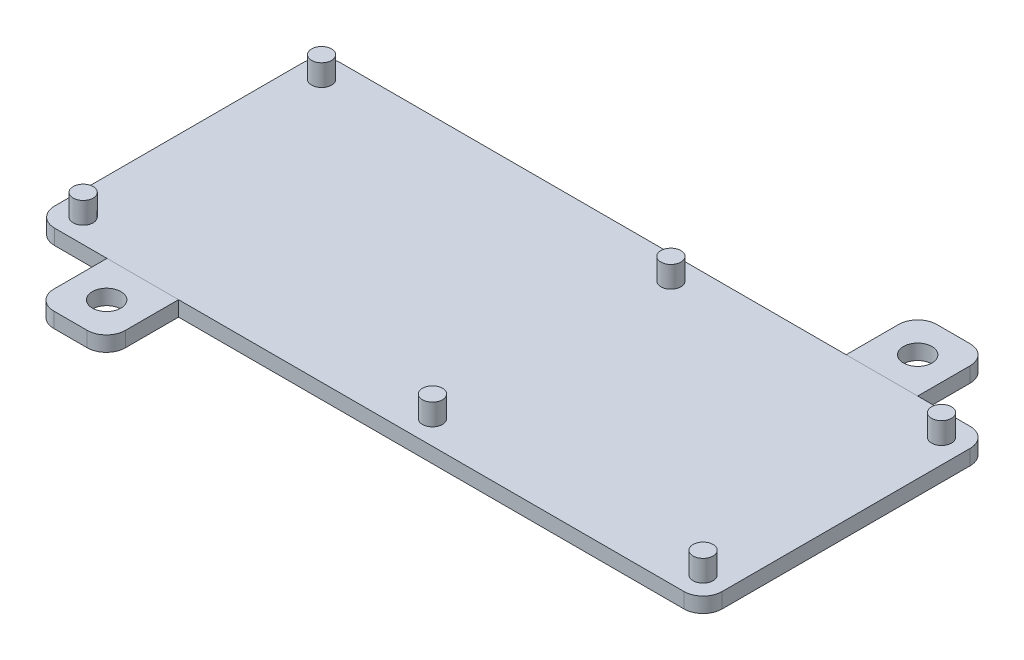
ISO-10303-21;
HEADER;
FILE_DESCRIPTION(('STEP AP214'),'2;1');
FILE_NAME('part.step','',(''),(''),'','','');
FILE_SCHEMA(('AUTOMOTIVE_DESIGN { 1 0 10303 214 1 1 1 1 }'));
ENDSEC;
DATA;
#1=APPLICATION_CONTEXT('core data for automotive mechanical design processes');
#2=APPLICATION_PROTOCOL_DEFINITION('international standard','automotive_design',2000,#1);
#3=PRODUCT_CONTEXT('',#1,'mechanical');
#4=PRODUCT('Part','Part','',(#3));
#5=PRODUCT_RELATED_PRODUCT_CATEGORY('part','',(#4));
#6=PRODUCT_DEFINITION_FORMATION('','',#4);
#7=PRODUCT_DEFINITION_CONTEXT('part definition',#1,'design');
#8=PRODUCT_DEFINITION('design','',#6,#7);
#9=PRODUCT_DEFINITION_SHAPE('','',#8);
#10=(LENGTH_UNIT() NAMED_UNIT(*) SI_UNIT(.MILLI.,.METRE.));
#11=(NAMED_UNIT(*) PLANE_ANGLE_UNIT() SI_UNIT($,.RADIAN.));
#12=(NAMED_UNIT(*) SI_UNIT($,.STERADIAN.) SOLID_ANGLE_UNIT());
#13=UNCERTAINTY_MEASURE_WITH_UNIT(LENGTH_MEASURE(1.E-05),#10,'distance_accuracy_value','');
#14=(GEOMETRIC_REPRESENTATION_CONTEXT(3) GLOBAL_UNCERTAINTY_ASSIGNED_CONTEXT((#13)) GLOBAL_UNIT_ASSIGNED_CONTEXT((#10,
#11,#12)) REPRESENTATION_CONTEXT('',''));
#15=CARTESIAN_POINT('',(0.,0.,0.));
#16=DIRECTION('',(0.,0.,1.));
#17=DIRECTION('',(1.,0.,0.));
#18=AXIS2_PLACEMENT_3D('',#15,#16,#17);
#19=CARTESIAN_POINT('',(-61.8399053845255,-42.5633245438735,-10.7268843414368));
#20=DIRECTION('',(1.,0.,0.));
#21=DIRECTION('',(0.,0.,-1.));
#22=AXIS2_PLACEMENT_3D('',#19,#20,#21);
#23=PLANE('',#22);
#24=DIRECTION('',(0.,0.,1.));
#25=VECTOR('',#24,1.);
#26=CARTESIAN_POINT('',(-61.8399053845255,-45.7383245438735,-10.7268843414368));
#27=LINE('',#26,#25);
#28=CARTESIAN_POINT('',(-61.8399053845255,-45.7383245438735,-21.7268843414368));
#29=VERTEX_POINT('',#28);
#30=CARTESIAN_POINT('',(-61.8399053845255,-45.7383245438735,-10.7268843414368));
#31=VERTEX_POINT('',#30);
#32=EDGE_CURVE('E128',#29,#31,#27,.T.);
#33=ORIENTED_EDGE('',*,*,#32,.F.);
#34=DIRECTION('',(0.,-1.,0.));
#35=VECTOR('',#34,1.);
#36=CARTESIAN_POINT('',(-61.8399053845255,-42.5633245438735,-21.7268843414368));
#37=LINE('',#36,#35);
#38=CARTESIAN_POINT('',(-61.8399053845255,-42.5633245438735,-21.7268843414368));
#39=VERTEX_POINT('',#38);
#40=EDGE_CURVE('E12',#29,#39,#37,.F.);
#41=ORIENTED_EDGE('',*,*,#40,.T.);
#42=DIRECTION('',(0.,0.,1.));
#43=VECTOR('',#42,1.);
#44=CARTESIAN_POINT('',(-61.8399053845255,-42.5633245438735,-10.7268843414368));
#45=LINE('',#44,#43);
#46=CARTESIAN_POINT('',(-61.8399053845255,-42.5633245438735,-10.7268843414368));
#47=VERTEX_POINT('',#46);
#48=EDGE_CURVE('E140',#39,#47,#45,.T.);
#49=ORIENTED_EDGE('',*,*,#48,.T.);
#50=DIRECTION('',(0.,-1.,0.));
#51=VECTOR('',#50,1.);
#52=CARTESIAN_POINT('',(-61.8399053845255,-42.5633245438735,-10.7268843414368));
#53=LINE('',#52,#51);
#54=EDGE_CURVE('E116',#47,#31,#53,.T.);
#55=ORIENTED_EDGE('',*,*,#54,.T.);
#56=EDGE_LOOP('',(#33,#41,#49,#55));
#57=FACE_BOUND('',#56,.T.);
#58=ADVANCED_FACE('F52',(#57),#23,.T.);
#59=CARTESIAN_POINT('',(-61.8399053845255,-42.5633245438735,-25.7268843414368));
#60=DIRECTION('',(0.,0.,-1.));
#61=DIRECTION('',(-1.,0.,0.));
#62=AXIS2_PLACEMENT_3D('',#59,#60,#61);
#63=PLANE('',#62);
#64=DIRECTION('',(1.,0.,0.));
#65=VECTOR('',#64,1.);
#66=CARTESIAN_POINT('',(-61.8399053845255,-45.7383245438735,-25.7268843414368));
#67=LINE('',#66,#65);
#68=CARTESIAN_POINT('',(-72.8399053845255,-45.7383245438735,-25.7268843414368));
#69=VERTEX_POINT('',#68);
#70=CARTESIAN_POINT('',(-65.8399053845255,-45.7383245438735,-25.7268843414368));
#71=VERTEX_POINT('',#70);
#72=EDGE_CURVE('E125',#69,#71,#67,.T.);
#73=ORIENTED_EDGE('',*,*,#72,.F.);
#74=DIRECTION('',(0.,-1.,0.));
#75=VECTOR('',#74,1.);
#76=CARTESIAN_POINT('',(-72.8399053845255,-42.5633245438735,-25.7268843414368));
#77=LINE('',#76,#75);
#78=CARTESIAN_POINT('',(-72.8399053845255,-42.5633245438735,-25.7268843414368));
#79=VERTEX_POINT('',#78);
#80=EDGE_CURVE('E155',#69,#79,#77,.F.);
#81=ORIENTED_EDGE('',*,*,#80,.T.);
#82=DIRECTION('',(1.,0.,0.));
#83=VECTOR('',#82,1.);
#84=CARTESIAN_POINT('',(-61.8399053845255,-42.5633245438735,-25.7268843414368));
#85=LINE('',#84,#83);
#86=CARTESIAN_POINT('',(-65.8399053845255,-42.5633245438735,-25.7268843414368));
#87=VERTEX_POINT('',#86);
#88=EDGE_CURVE('E135',#79,#87,#85,.T.);
#89=ORIENTED_EDGE('',*,*,#88,.T.);
#90=DIRECTION('',(0.,-1.,0.));
#91=VECTOR('',#90,1.);
#92=CARTESIAN_POINT('',(-65.8399053845255,-42.5633245438735,-25.7268843414368));
#93=LINE('',#92,#91);
#94=EDGE_CURVE('E152',#87,#71,#93,.T.);
#95=ORIENTED_EDGE('',*,*,#94,.T.);
#96=EDGE_LOOP('',(#73,#81,#89,#95));
#97=FACE_BOUND('',#96,.T.);
#98=ADVANCED_FACE('F165',(#97),#63,.T.);
#99=CARTESIAN_POINT('',(-76.8399053845255,-42.5633245438735,-10.7268843414368));
#100=DIRECTION('',(-1.,0.,0.));
#101=DIRECTION('',(0.,0.,1.));
#102=AXIS2_PLACEMENT_3D('',#99,#100,#101);
#103=PLANE('',#102);
#104=DIRECTION('',(0.,0.,-1.));
#105=VECTOR('',#104,1.);
#106=CARTESIAN_POINT('',(-76.8399053845255,-42.5633245438735,-10.7268843414368));
#107=LINE('',#106,#105);
#108=CARTESIAN_POINT('',(-76.8399053845255,-42.5633245438735,-10.7268843414368));
#109=VERTEX_POINT('',#108);
#110=CARTESIAN_POINT('',(-76.8399053845255,-42.5633245438735,-21.7268843414368));
#111=VERTEX_POINT('',#110);
#112=EDGE_CURVE('E137',#109,#111,#107,.T.);
#113=ORIENTED_EDGE('',*,*,#112,.T.);
#114=DIRECTION('',(0.,-1.,0.));
#115=VECTOR('',#114,1.);
#116=CARTESIAN_POINT('',(-76.8399053845255,-42.5633245438735,-21.7268843414368));
#117=LINE('',#116,#115);
#118=CARTESIAN_POINT('',(-76.8399053845255,-45.7383245438735,-21.7268843414368));
#119=VERTEX_POINT('',#118);
#120=EDGE_CURVE('E123',#111,#119,#117,.T.);
#121=ORIENTED_EDGE('',*,*,#120,.T.);
#122=DIRECTION('',(0.,0.,-1.));
#123=VECTOR('',#122,1.);
#124=CARTESIAN_POINT('',(-76.8399053845255,-45.7383245438735,-10.7268843414368));
#125=LINE('',#124,#123);
#126=CARTESIAN_POINT('',(-76.8399053845255,-45.7383245438735,-10.7268843414368));
#127=VERTEX_POINT('',#126);
#128=EDGE_CURVE('E120',#127,#119,#125,.T.);
#129=ORIENTED_EDGE('',*,*,#128,.F.);
#130=DIRECTION('',(0.,-1.,0.));
#131=VECTOR('',#130,1.);
#132=CARTESIAN_POINT('',(-76.8399053845255,-42.5633245438735,-10.7268843414368));
#133=LINE('',#132,#131);
#134=EDGE_CURVE('E105',#109,#127,#133,.T.);
#135=ORIENTED_EDGE('',*,*,#134,.F.);
#136=EDGE_LOOP('',(#113,#121,#129,#135));
#137=FACE_BOUND('',#136,.T.);
#138=ADVANCED_FACE('F121',(#137),#103,.T.);
#139=CARTESIAN_POINT('',(-61.8399053845255,-42.5633245438735,-10.7268843414368));
#140=DIRECTION('',(0.,0.,1.));
#141=DIRECTION('',(1.,0.,0.));
#142=AXIS2_PLACEMENT_3D('',#139,#140,#141);
#143=PLANE('',#142);
#144=DIRECTION('',(-1.,0.,0.));
#145=VECTOR('',#144,1.);
#146=CARTESIAN_POINT('',(-61.8399053845255,-45.7383245438735,-10.7268843414368));
#147=LINE('',#146,#145);
#148=EDGE_CURVE('E110',#31,#127,#147,.T.);
#149=ORIENTED_EDGE('',*,*,#148,.F.);
#150=ORIENTED_EDGE('',*,*,#54,.F.);
#151=DIRECTION('',(-1.,0.,0.));
#152=VECTOR('',#151,1.);
#153=CARTESIAN_POINT('',(-61.8399053845255,-42.5633245438735,-10.7268843414368));
#154=LINE('',#153,#152);
#155=EDGE_CURVE('E112',#47,#109,#154,.T.);
#156=ORIENTED_EDGE('',*,*,#155,.T.);
#157=ORIENTED_EDGE('',*,*,#134,.T.);
#158=EDGE_LOOP('',(#149,#150,#156,#157));
#159=FACE_BOUND('',#158,.T.);
#160=ADVANCED_FACE('F107',(#159),#143,.T.);
#161=CARTESIAN_POINT('',(0.,-42.5633245438735,0.));
#162=DIRECTION('',(0.,1.,0.));
#163=DIRECTION('',(0.,0.,1.));
#164=AXIS2_PLACEMENT_3D('',#161,#162,#163);
#165=PLANE('',#164);
#166=CARTESIAN_POINT('',(-69.3399053845255,-42.5633245438735,-18.2268843414368));
#167=DIRECTION('',(0.,-1.,0.));
#168=DIRECTION('',(0.,0.,-1.));
#169=AXIS2_PLACEMENT_3D('',#166,#167,#168);
#170=CIRCLE('',#169,3.00000000000001);
#171=CARTESIAN_POINT('',(-69.3399053845255,-42.5633245438735,-21.2268843414368));
#172=VERTEX_POINT('',#171);
#173=EDGE_CURVE('E131',#172,#172,#170,.T.);
#174=ORIENTED_EDGE('',*,*,#173,.T.);
#175=EDGE_LOOP('',(#174));
#176=FACE_BOUND('',#175,.T.);
#177=ORIENTED_EDGE('',*,*,#88,.F.);
#178=CARTESIAN_POINT('',(-72.8399053845255,-42.5633245438735,-21.7268843414368));
#179=DIRECTION('',(0.,1.,0.));
#180=DIRECTION('',(0.,0.,1.));
#181=AXIS2_PLACEMENT_3D('',#178,#179,#180);
#182=CIRCLE('',#181,4.);
#183=EDGE_CURVE('E60',#79,#111,#182,.T.);
#184=ORIENTED_EDGE('',*,*,#183,.T.);
#185=ORIENTED_EDGE('',*,*,#112,.F.);
#186=ORIENTED_EDGE('',*,*,#155,.F.);
#187=ORIENTED_EDGE('',*,*,#48,.F.);
#188=CARTESIAN_POINT('',(-65.8399053845255,-42.5633245438735,-21.7268843414368));
#189=DIRECTION('',(0.,1.,0.));
#190=DIRECTION('',(0.,0.,1.));
#191=AXIS2_PLACEMENT_3D('',#188,#189,#190);
#192=CIRCLE('',#191,4.);
#193=EDGE_CURVE('E72',#39,#87,#192,.T.);
#194=ORIENTED_EDGE('',*,*,#193,.T.);
#195=EDGE_LOOP('',(#177,#184,#185,#186,#187,#194));
#196=FACE_BOUND('',#195,.T.);
#197=ADVANCED_FACE('F158',(#176,#196),#165,.T.);
#198=CARTESIAN_POINT('',(0.,-45.7383245438735,0.));
#199=DIRECTION('',(0.,1.,0.));
#200=DIRECTION('',(0.,0.,1.));
#201=AXIS2_PLACEMENT_3D('',#198,#199,#200);
#202=PLANE('',#201);
#203=CARTESIAN_POINT('',(-69.3399053845255,-45.7383245438735,-18.2268843414368));
#204=DIRECTION('',(0.,-1.,0.));
#205=DIRECTION('',(0.,0.,-1.));
#206=AXIS2_PLACEMENT_3D('',#203,#204,#205);
#207=CIRCLE('',#206,3.00000000000001);
#208=CARTESIAN_POINT('',(-69.3399053845255,-45.7383245438735,-21.2268843414368));
#209=VERTEX_POINT('',#208);
#210=EDGE_CURVE('E142',#209,#209,#207,.T.);
#211=ORIENTED_EDGE('',*,*,#210,.F.);
#212=EDGE_LOOP('',(#211));
#213=FACE_BOUND('',#212,.T.);
#214=ORIENTED_EDGE('',*,*,#128,.T.);
#215=CARTESIAN_POINT('',(-72.8399053845255,-45.7383245438735,-21.7268843414368));
#216=DIRECTION('',(0.,1.,0.));
#217=DIRECTION('',(0.,0.,1.));
#218=AXIS2_PLACEMENT_3D('',#215,#216,#217);
#219=CIRCLE('',#218,4.);
#220=EDGE_CURVE('E150',#119,#69,#219,.F.);
#221=ORIENTED_EDGE('',*,*,#220,.T.);
#222=ORIENTED_EDGE('',*,*,#72,.T.);
#223=CARTESIAN_POINT('',(-65.8399053845255,-45.7383245438735,-21.7268843414368));
#224=DIRECTION('',(0.,1.,0.));
#225=DIRECTION('',(0.,0.,1.));
#226=AXIS2_PLACEMENT_3D('',#223,#224,#225);
#227=CIRCLE('',#226,4.);
#228=EDGE_CURVE('E148',#71,#29,#227,.F.);
#229=ORIENTED_EDGE('',*,*,#228,.T.);
#230=ORIENTED_EDGE('',*,*,#32,.T.);
#231=ORIENTED_EDGE('',*,*,#148,.T.);
#232=EDGE_LOOP('',(#214,#221,#222,#229,#230,#231));
#233=FACE_BOUND('',#232,.T.);
#234=ADVANCED_FACE('F127',(#213,#233),#202,.F.);
#235=CARTESIAN_POINT('',(-69.3399053845255,-42.5633245438735,-18.2268843414368));
#236=DIRECTION('',(0.,-1.,0.));
#237=DIRECTION('',(0.,0.,-1.));
#238=AXIS2_PLACEMENT_3D('',#235,#236,#237);
#239=CYLINDRICAL_SURFACE('',#238,3.00000000000001);
#240=ORIENTED_EDGE('',*,*,#173,.F.);
#241=EDGE_LOOP('',(#240));
#242=FACE_BOUND('',#241,.T.);
#243=ORIENTED_EDGE('',*,*,#210,.T.);
#244=EDGE_LOOP('',(#243));
#245=FACE_BOUND('',#244,.T.);
#246=ADVANCED_FACE('F173',(#242,#245),#239,.F.);
#247=CARTESIAN_POINT('',(-72.8399053845255,-42.5633245438735,-21.7268843414368));
#248=DIRECTION('',(0.,-1.,0.));
#249=DIRECTION('',(0.,0.,-1.));
#250=AXIS2_PLACEMENT_3D('',#247,#248,#249);
#251=CYLINDRICAL_SURFACE('',#250,4.);
#252=ORIENTED_EDGE('',*,*,#183,.F.);
#253=ORIENTED_EDGE('',*,*,#80,.F.);
#254=ORIENTED_EDGE('',*,*,#220,.F.);
#255=ORIENTED_EDGE('',*,*,#120,.F.);
#256=EDGE_LOOP('',(#252,#253,#254,#255));
#257=FACE_BOUND('',#256,.T.);
#258=ADVANCED_FACE('F161',(#257),#251,.T.);
#259=CARTESIAN_POINT('',(-65.8399053845255,-42.5633245438735,-21.7268843414368));
#260=DIRECTION('',(0.,-1.,0.));
#261=DIRECTION('',(0.,0.,-1.));
#262=AXIS2_PLACEMENT_3D('',#259,#260,#261);
#263=CYLINDRICAL_SURFACE('',#262,4.);
#264=ORIENTED_EDGE('',*,*,#193,.F.);
#265=ORIENTED_EDGE('',*,*,#40,.F.);
#266=ORIENTED_EDGE('',*,*,#228,.F.);
#267=ORIENTED_EDGE('',*,*,#94,.F.);
#268=EDGE_LOOP('',(#264,#265,#266,#267));
#269=FACE_BOUND('',#268,.T.);
#270=ADVANCED_FACE('F54',(#269),#263,.T.);
#271=CLOSED_SHELL('',(#58,#98,#138,#160,#197,#234,#246,#258,#270));
#272=MANIFOLD_SOLID_BREP('B2',#271);
#273=CARTESIAN_POINT('',(-171.839905384526,-42.5633245438735,49.2731156585631));
#274=DIRECTION('',(-1.,0.,0.));
#275=DIRECTION('',(0.,0.,1.));
#276=AXIS2_PLACEMENT_3D('',#273,#274,#275);
#277=PLANE('',#276);
#278=DIRECTION('',(0.,0.,-1.));
#279=VECTOR('',#278,1.);
#280=CARTESIAN_POINT('',(-171.839905384526,-45.7383245438735,49.2731156585631));
#281=LINE('',#280,#279);
#282=CARTESIAN_POINT('',(-171.839905384526,-45.7383245438735,60.4172239831278));
#283=VERTEX_POINT('',#282);
#284=CARTESIAN_POINT('',(-171.839905384526,-45.7383245438735,49.2731156585631));
#285=VERTEX_POINT('',#284);
#286=EDGE_CURVE('E334',#283,#285,#281,.T.);
#287=ORIENTED_EDGE('',*,*,#286,.F.);
#288=DIRECTION('',(0.,-1.,0.));
#289=VECTOR('',#288,1.);
#290=CARTESIAN_POINT('',(-171.839905384526,-42.5633245438735,60.4172239831278));
#291=LINE('',#290,#289);
#292=CARTESIAN_POINT('',(-171.839905384526,-42.5633245438735,60.4172239831278));
#293=VERTEX_POINT('',#292);
#294=EDGE_CURVE('E50',#283,#293,#291,.F.);
#295=ORIENTED_EDGE('',*,*,#294,.T.);
#296=DIRECTION('',(0.,0.,-1.));
#297=VECTOR('',#296,1.);
#298=CARTESIAN_POINT('',(-171.839905384526,-42.5633245438735,49.2731156585631));
#299=LINE('',#298,#297);
#300=CARTESIAN_POINT('',(-171.839905384526,-42.5633245438735,49.2731156585631));
#301=VERTEX_POINT('',#300);
#302=EDGE_CURVE('E309',#293,#301,#299,.T.);
#303=ORIENTED_EDGE('',*,*,#302,.T.);
#304=DIRECTION('',(0.,-1.,0.));
#305=VECTOR('',#304,1.);
#306=CARTESIAN_POINT('',(-171.839905384526,-42.5633245438735,49.2731156585631));
#307=LINE('',#306,#305);
#308=EDGE_CURVE('E311',#301,#285,#307,.T.);
#309=ORIENTED_EDGE('',*,*,#308,.T.);
#310=EDGE_LOOP('',(#287,#295,#303,#309));
#311=FACE_BOUND('',#310,.T.);
#312=ADVANCED_FACE('F258',(#311),#277,.T.);
#313=CARTESIAN_POINT('',(-171.839905384526,-42.5633245438735,64.4172239831278));
#314=DIRECTION('',(0.,0.,1.));
#315=DIRECTION('',(1.,0.,0.));
#316=AXIS2_PLACEMENT_3D('',#313,#314,#315);
#317=PLANE('',#316);
#318=DIRECTION('',(-1.,0.,0.));
#319=VECTOR('',#318,1.);
#320=CARTESIAN_POINT('',(-171.839905384526,-45.7383245438735,64.4172239831278));
#321=LINE('',#320,#319);
#322=CARTESIAN_POINT('',(-160.839905384526,-45.7383245438735,64.4172239831278));
#323=VERTEX_POINT('',#322);
#324=CARTESIAN_POINT('',(-167.839905384526,-45.7383245438735,64.4172239831278));
#325=VERTEX_POINT('',#324);
#326=EDGE_CURVE('E315',#323,#325,#321,.T.);
#327=ORIENTED_EDGE('',*,*,#326,.F.);
#328=DIRECTION('',(0.,-1.,0.));
#329=VECTOR('',#328,1.);
#330=CARTESIAN_POINT('',(-160.839905384526,-42.5633245438735,64.4172239831278));
#331=LINE('',#330,#329);
#332=CARTESIAN_POINT('',(-160.839905384526,-42.5633245438735,64.4172239831278));
#333=VERTEX_POINT('',#332);
#334=EDGE_CURVE('E354',#323,#333,#331,.F.);
#335=ORIENTED_EDGE('',*,*,#334,.T.);
#336=DIRECTION('',(-1.,0.,0.));
#337=VECTOR('',#336,1.);
#338=CARTESIAN_POINT('',(-171.839905384526,-42.5633245438735,64.4172239831278));
#339=LINE('',#338,#337);
#340=CARTESIAN_POINT('',(-167.839905384526,-42.5633245438735,64.4172239831278));
#341=VERTEX_POINT('',#340);
#342=EDGE_CURVE('E323',#333,#341,#339,.T.);
#343=ORIENTED_EDGE('',*,*,#342,.T.);
#344=DIRECTION('',(0.,-1.,0.));
#345=VECTOR('',#344,1.);
#346=CARTESIAN_POINT('',(-167.839905384526,-42.5633245438735,64.4172239831278));
#347=LINE('',#346,#345);
#348=EDGE_CURVE('E351',#341,#325,#347,.T.);
#349=ORIENTED_EDGE('',*,*,#348,.T.);
#350=EDGE_LOOP('',(#327,#335,#343,#349));
#351=FACE_BOUND('',#350,.T.);
#352=ADVANCED_FACE('F368',(#351),#317,.T.);
#353=CARTESIAN_POINT('',(-156.839905384526,-42.5633245438735,49.2731156585631));
#354=DIRECTION('',(1.,0.,0.));
#355=DIRECTION('',(0.,0.,-1.));
#356=AXIS2_PLACEMENT_3D('',#353,#354,#355);
#357=PLANE('',#356);
#358=DIRECTION('',(0.,0.,1.));
#359=VECTOR('',#358,1.);
#360=CARTESIAN_POINT('',(-156.839905384526,-42.5633245438735,49.2731156585631));
#361=LINE('',#360,#359);
#362=CARTESIAN_POINT('',(-156.839905384526,-42.5633245438735,49.2731156585631));
#363=VERTEX_POINT('',#362);
#364=CARTESIAN_POINT('',(-156.839905384526,-42.5633245438735,60.4172239831278));
#365=VERTEX_POINT('',#364);
#366=EDGE_CURVE('E328',#363,#365,#361,.T.);
#367=ORIENTED_EDGE('',*,*,#366,.T.);
#368=DIRECTION('',(0.,-1.,0.));
#369=VECTOR('',#368,1.);
#370=CARTESIAN_POINT('',(-156.839905384526,-42.5633245438735,60.4172239831278));
#371=LINE('',#370,#369);
#372=CARTESIAN_POINT('',(-156.839905384526,-45.7383245438735,60.4172239831278));
#373=VERTEX_POINT('',#372);
#374=EDGE_CURVE('E343',#365,#373,#371,.T.);
#375=ORIENTED_EDGE('',*,*,#374,.T.);
#376=DIRECTION('',(0.,0.,1.));
#377=VECTOR('',#376,1.);
#378=CARTESIAN_POINT('',(-156.839905384526,-45.7383245438735,49.2731156585631));
#379=LINE('',#378,#377);
#380=CARTESIAN_POINT('',(-156.839905384526,-45.7383245438735,49.2731156585631));
#381=VERTEX_POINT('',#380);
#382=EDGE_CURVE('E338',#381,#373,#379,.T.);
#383=ORIENTED_EDGE('',*,*,#382,.F.);
#384=DIRECTION('',(0.,-1.,0.));
#385=VECTOR('',#384,1.);
#386=CARTESIAN_POINT('',(-156.839905384526,-42.5633245438735,49.2731156585631));
#387=LINE('',#386,#385);
#388=EDGE_CURVE('E322',#363,#381,#387,.T.);
#389=ORIENTED_EDGE('',*,*,#388,.F.);
#390=EDGE_LOOP('',(#367,#375,#383,#389));
#391=FACE_BOUND('',#390,.T.);
#392=ADVANCED_FACE('F361',(#391),#357,.T.);
#393=CARTESIAN_POINT('',(-171.839905384526,-42.5633245438735,49.2731156585631));
#394=DIRECTION('',(0.,0.,-1.));
#395=DIRECTION('',(-1.,0.,0.));
#396=AXIS2_PLACEMENT_3D('',#393,#394,#395);
#397=PLANE('',#396);
#398=DIRECTION('',(1.,0.,0.));
#399=VECTOR('',#398,1.);
#400=CARTESIAN_POINT('',(-171.839905384526,-45.7383245438735,49.2731156585631));
#401=LINE('',#400,#399);
#402=EDGE_CURVE('E321',#285,#381,#401,.T.);
#403=ORIENTED_EDGE('',*,*,#402,.F.);
#404=ORIENTED_EDGE('',*,*,#308,.F.);
#405=DIRECTION('',(1.,0.,0.));
#406=VECTOR('',#405,1.);
#407=CARTESIAN_POINT('',(-171.839905384526,-42.5633245438735,49.2731156585631));
#408=LINE('',#407,#406);
#409=EDGE_CURVE('E314',#301,#363,#408,.T.);
#410=ORIENTED_EDGE('',*,*,#409,.T.);
#411=ORIENTED_EDGE('',*,*,#388,.T.);
#412=EDGE_LOOP('',(#403,#404,#410,#411));
#413=FACE_BOUND('',#412,.T.);
#414=ADVANCED_FACE('F319',(#413),#397,.T.);
#415=CARTESIAN_POINT('',(0.,-42.5633245438735,0.));
#416=DIRECTION('',(0.,1.,0.));
#417=DIRECTION('',(0.,0.,1.));
#418=AXIS2_PLACEMENT_3D('',#415,#416,#417);
#419=PLANE('',#418);
#420=CARTESIAN_POINT('',(-164.339905384526,-42.5633245438735,56.8451698208454));
#421=DIRECTION('',(0.,-1.,0.));
#422=DIRECTION('',(0.,0.,-1.));
#423=AXIS2_PLACEMENT_3D('',#420,#421,#422);
#424=CIRCLE('',#423,2.99999999999999);
#425=CARTESIAN_POINT('',(-164.339905384526,-42.5633245438735,53.8451698208455));
#426=VERTEX_POINT('',#425);
#427=EDGE_CURVE('E336',#426,#426,#424,.T.);
#428=ORIENTED_EDGE('',*,*,#427,.T.);
#429=EDGE_LOOP('',(#428));
#430=FACE_BOUND('',#429,.T.);
#431=ORIENTED_EDGE('',*,*,#342,.F.);
#432=CARTESIAN_POINT('',(-160.839905384526,-42.5633245438735,60.4172239831278));
#433=DIRECTION('',(0.,1.,0.));
#434=DIRECTION('',(0.,0.,1.));
#435=AXIS2_PLACEMENT_3D('',#432,#433,#434);
#436=CIRCLE('',#435,4.);
#437=EDGE_CURVE('E266',#333,#365,#436,.T.);
#438=ORIENTED_EDGE('',*,*,#437,.T.);
#439=ORIENTED_EDGE('',*,*,#366,.F.);
#440=ORIENTED_EDGE('',*,*,#409,.F.);
#441=ORIENTED_EDGE('',*,*,#302,.F.);
#442=CARTESIAN_POINT('',(-167.839905384526,-42.5633245438735,60.4172239831278));
#443=DIRECTION('',(0.,1.,0.));
#444=DIRECTION('',(0.,0.,1.));
#445=AXIS2_PLACEMENT_3D('',#442,#443,#444);
#446=CIRCLE('',#445,4.);
#447=EDGE_CURVE('E278',#293,#341,#446,.T.);
#448=ORIENTED_EDGE('',*,*,#447,.T.);
#449=EDGE_LOOP('',(#431,#438,#439,#440,#441,#448));
#450=FACE_BOUND('',#449,.T.);
#451=ADVANCED_FACE('F326',(#430,#450),#419,.T.);
#452=CARTESIAN_POINT('',(0.,-45.7383245438735,0.));
#453=DIRECTION('',(0.,1.,0.));
#454=DIRECTION('',(0.,0.,1.));
#455=AXIS2_PLACEMENT_3D('',#452,#453,#454);
#456=PLANE('',#455);
#457=CARTESIAN_POINT('',(-164.339905384526,-45.7383245438735,56.8451698208454));
#458=DIRECTION('',(0.,-1.,0.));
#459=DIRECTION('',(0.,0.,-1.));
#460=AXIS2_PLACEMENT_3D('',#457,#458,#459);
#461=CIRCLE('',#460,2.99999999999999);
#462=CARTESIAN_POINT('',(-164.339905384526,-45.7383245438735,53.8451698208455));
#463=VERTEX_POINT('',#462);
#464=EDGE_CURVE('E402',#463,#463,#461,.T.);
#465=ORIENTED_EDGE('',*,*,#464,.F.);
#466=EDGE_LOOP('',(#465));
#467=FACE_BOUND('',#466,.T.);
#468=ORIENTED_EDGE('',*,*,#382,.T.);
#469=CARTESIAN_POINT('',(-160.839905384526,-45.7383245438735,60.4172239831278));
#470=DIRECTION('',(0.,1.,0.));
#471=DIRECTION('',(0.,0.,1.));
#472=AXIS2_PLACEMENT_3D('',#469,#470,#471);
#473=CIRCLE('',#472,4.);
#474=EDGE_CURVE('E349',#373,#323,#473,.F.);
#475=ORIENTED_EDGE('',*,*,#474,.T.);
#476=ORIENTED_EDGE('',*,*,#326,.T.);
#477=CARTESIAN_POINT('',(-167.839905384526,-45.7383245438735,60.4172239831278));
#478=DIRECTION('',(0.,1.,0.));
#479=DIRECTION('',(0.,0.,1.));
#480=AXIS2_PLACEMENT_3D('',#477,#478,#479);
#481=CIRCLE('',#480,4.);
#482=EDGE_CURVE('E347',#325,#283,#481,.F.);
#483=ORIENTED_EDGE('',*,*,#482,.T.);
#484=ORIENTED_EDGE('',*,*,#286,.T.);
#485=ORIENTED_EDGE('',*,*,#402,.T.);
#486=EDGE_LOOP('',(#468,#475,#476,#483,#484,#485));
#487=FACE_BOUND('',#486,.T.);
#488=ADVANCED_FACE('F366',(#467,#487),#456,.F.);
#489=CARTESIAN_POINT('',(-164.339905384526,-42.5633245438735,56.8451698208454));
#490=DIRECTION('',(0.,-1.,0.));
#491=DIRECTION('',(0.,0.,-1.));
#492=AXIS2_PLACEMENT_3D('',#489,#490,#491);
#493=CYLINDRICAL_SURFACE('',#492,2.99999999999999);
#494=ORIENTED_EDGE('',*,*,#427,.F.);
#495=EDGE_LOOP('',(#494));
#496=FACE_BOUND('',#495,.T.);
#497=ORIENTED_EDGE('',*,*,#464,.T.);
#498=EDGE_LOOP('',(#497));
#499=FACE_BOUND('',#498,.T.);
#500=ADVANCED_FACE('F375',(#496,#499),#493,.F.);
#501=CARTESIAN_POINT('',(-160.839905384526,-42.5633245438735,60.4172239831278));
#502=DIRECTION('',(0.,-1.,0.));
#503=DIRECTION('',(0.,0.,-1.));
#504=AXIS2_PLACEMENT_3D('',#501,#502,#503);
#505=CYLINDRICAL_SURFACE('',#504,4.);
#506=ORIENTED_EDGE('',*,*,#437,.F.);
#507=ORIENTED_EDGE('',*,*,#334,.F.);
#508=ORIENTED_EDGE('',*,*,#474,.F.);
#509=ORIENTED_EDGE('',*,*,#374,.F.);
#510=EDGE_LOOP('',(#506,#507,#508,#509));
#511=FACE_BOUND('',#510,.T.);
#512=ADVANCED_FACE('F363',(#511),#505,.T.);
#513=CARTESIAN_POINT('',(-167.839905384526,-42.5633245438735,60.4172239831278));
#514=DIRECTION('',(0.,-1.,0.));
#515=DIRECTION('',(0.,0.,-1.));
#516=AXIS2_PLACEMENT_3D('',#513,#514,#515);
#517=CYLINDRICAL_SURFACE('',#516,4.);
#518=ORIENTED_EDGE('',*,*,#447,.F.);
#519=ORIENTED_EDGE('',*,*,#294,.F.);
#520=ORIENTED_EDGE('',*,*,#482,.F.);
#521=ORIENTED_EDGE('',*,*,#348,.F.);
#522=EDGE_LOOP('',(#518,#519,#520,#521));
#523=FACE_BOUND('',#522,.T.);
#524=ADVANCED_FACE('F260',(#523),#517,.T.);
#525=CLOSED_SHELL('',(#312,#352,#392,#414,#451,#488,#500,#512,#524));
#526=MANIFOLD_SOLID_BREP('B6',#525);
#527=CARTESIAN_POINT('',(-181.839905384526,-42.5633245438735,-5.72688434143686));
#528=DIRECTION('',(0.,1.,0.));
#529=DIRECTION('',(0.,0.,1.));
#530=AXIS2_PLACEMENT_3D('',#527,#528,#529);
#531=CYLINDRICAL_SURFACE('',#530,2.09549999999999);
#532=CARTESIAN_POINT('',(-181.839905384526,-42.5633245438735,-5.72688434143686));
#533=DIRECTION('',(0.,-1.,0.));
#534=DIRECTION('',(0.,0.,-1.));
#535=AXIS2_PLACEMENT_3D('',#532,#533,#534);
#536=CIRCLE('',#535,2.09549999999999);
#537=CARTESIAN_POINT('',(-181.839905384526,-42.5633245438735,-7.82238434143684));
#538=VERTEX_POINT('',#537);
#539=EDGE_CURVE('E562',#538,#538,#536,.T.);
#540=ORIENTED_EDGE('',*,*,#539,.F.);
#541=EDGE_LOOP('',(#540));
#542=FACE_BOUND('',#541,.T.);
#543=CARTESIAN_POINT('',(-181.839905384526,-38.0633245438735,-5.72688434143686));
#544=DIRECTION('',(0.,-1.,0.));
#545=DIRECTION('',(0.,0.,-1.));
#546=AXIS2_PLACEMENT_3D('',#543,#544,#545);
#547=CIRCLE('',#546,2.09549999999999);
#548=CARTESIAN_POINT('',(-181.839905384526,-38.0633245438735,-7.82238434143684));
#549=VERTEX_POINT('',#548);
#550=EDGE_CURVE('E565',#549,#549,#547,.T.);
#551=ORIENTED_EDGE('',*,*,#550,.T.);
#552=EDGE_LOOP('',(#551));
#553=FACE_BOUND('',#552,.T.);
#554=ADVANCED_FACE('F455',(#542,#553),#531,.T.);
#555=CARTESIAN_POINT('',(-181.839905384526,-38.0633245438735,-5.72688434143686));
#556=DIRECTION('',(0.,-1.,0.));
#557=DIRECTION('',(0.,0.,-1.));
#558=AXIS2_PLACEMENT_3D('',#555,#556,#557);
#559=PLANE('',#558);
#560=ORIENTED_EDGE('',*,*,#550,.F.);
#561=EDGE_LOOP('',(#560));
#562=FACE_BOUND('',#561,.T.);
#563=ADVANCED_FACE('F649',(#562),#559,.F.);
#564=CARTESIAN_POINT('',(-46.8399053845255,-45.7383245438735,-10.7268843414368));
#565=DIRECTION('',(-1.,0.,0.));
#566=DIRECTION('',(0.,0.,1.));
#567=AXIS2_PLACEMENT_3D('',#564,#565,#566);
#568=PLANE('',#567);
#569=DIRECTION('',(0.,0.,1.));
#570=VECTOR('',#569,1.);
#571=CARTESIAN_POINT('',(-46.8399053845255,-45.7383245438735,-10.7268843414368));
#572=LINE('',#571,#570);
#573=CARTESIAN_POINT('',(-46.8399053845255,-45.7383245438735,-6.72688434143683));
#574=VERTEX_POINT('',#573);
#575=CARTESIAN_POINT('',(-46.8399053845255,-45.7383245438735,45.2731156585631));
#576=VERTEX_POINT('',#575);
#577=EDGE_CURVE('E540',#574,#576,#572,.T.);
#578=ORIENTED_EDGE('',*,*,#577,.F.);
#579=DIRECTION('',(0.,1.,0.));
#580=VECTOR('',#579,1.);
#581=CARTESIAN_POINT('',(-46.8399053845255,-45.7383245438735,-6.72688434143683));
#582=LINE('',#581,#580);
#583=CARTESIAN_POINT('',(-46.8399053845255,-42.5633245438735,-6.72688434143683));
#584=VERTEX_POINT('',#583);
#585=EDGE_CURVE('E524',#574,#584,#582,.T.);
#586=ORIENTED_EDGE('',*,*,#585,.T.);
#587=DIRECTION('',(0.,0.,1.));
#588=VECTOR('',#587,1.);
#589=CARTESIAN_POINT('',(-46.8399053845255,-42.5633245438735,-10.7268843414368));
#590=LINE('',#589,#588);
#591=CARTESIAN_POINT('',(-46.8399053845255,-42.5633245438735,45.2731156585631));
#592=VERTEX_POINT('',#591);
#593=EDGE_CURVE('E537',#584,#592,#590,.T.);
#594=ORIENTED_EDGE('',*,*,#593,.T.);
#595=DIRECTION('',(0.,1.,0.));
#596=VECTOR('',#595,1.);
#597=CARTESIAN_POINT('',(-46.8399053845255,-45.7383245438735,45.2731156585631));
#598=LINE('',#597,#596);
#599=EDGE_CURVE('E542',#592,#576,#598,.F.);
#600=ORIENTED_EDGE('',*,*,#599,.T.);
#601=EDGE_LOOP('',(#578,#586,#594,#600));
#602=FACE_BOUND('',#601,.T.);
#603=ADVANCED_FACE('F536',(#602),#568,.F.);
#604=CARTESIAN_POINT('',(-186.839905384526,-45.7383245438735,49.2731156585631));
#605=DIRECTION('',(0.,0.,-1.));
#606=DIRECTION('',(-1.,0.,0.));
#607=AXIS2_PLACEMENT_3D('',#604,#605,#606);
#608=PLANE('',#607);
#609=DIRECTION('',(-1.,0.,0.));
#610=VECTOR('',#609,1.);
#611=CARTESIAN_POINT('',(-186.839905384526,-45.7383245438735,49.2731156585631));
#612=LINE('',#611,#610);
#613=CARTESIAN_POINT('',(-50.8399053845255,-45.7383245438735,49.2731156585631));
#614=VERTEX_POINT('',#613);
#615=CARTESIAN_POINT('',(-182.839905384526,-45.7383245438735,49.2731156585631));
#616=VERTEX_POINT('',#615);
#617=EDGE_CURVE('E601',#614,#616,#612,.T.);
#618=ORIENTED_EDGE('',*,*,#617,.F.);
#619=DIRECTION('',(0.,1.,0.));
#620=VECTOR('',#619,1.);
#621=CARTESIAN_POINT('',(-50.8399053845255,-45.7383245438735,49.2731156585631));
#622=LINE('',#621,#620);
#623=CARTESIAN_POINT('',(-50.8399053845255,-42.5633245438735,49.2731156585631));
#624=VERTEX_POINT('',#623);
#625=EDGE_CURVE('E585',#614,#624,#622,.T.);
#626=ORIENTED_EDGE('',*,*,#625,.T.);
#627=DIRECTION('',(-1.,0.,0.));
#628=VECTOR('',#627,1.);
#629=CARTESIAN_POINT('',(-186.839905384526,-42.5633245438735,49.2731156585631));
#630=LINE('',#629,#628);
#631=CARTESIAN_POINT('',(-182.839905384526,-42.5633245438735,49.2731156585631));
#632=VERTEX_POINT('',#631);
#633=EDGE_CURVE('E546',#624,#632,#630,.T.);
#634=ORIENTED_EDGE('',*,*,#633,.T.);
#635=DIRECTION('',(0.,1.,0.));
#636=VECTOR('',#635,1.);
#637=CARTESIAN_POINT('',(-182.839905384526,-45.7383245438735,49.2731156585631));
#638=LINE('',#637,#636);
#639=EDGE_CURVE('E583',#632,#616,#638,.F.);
#640=ORIENTED_EDGE('',*,*,#639,.T.);
#641=EDGE_LOOP('',(#618,#626,#634,#640));
#642=FACE_BOUND('',#641,.T.);
#643=ADVANCED_FACE('F672',(#642),#608,.F.);
#644=CARTESIAN_POINT('',(-186.839905384526,-45.7383245438735,-10.7268843414368));
#645=DIRECTION('',(1.,0.,0.));
#646=DIRECTION('',(0.,0.,-1.));
#647=AXIS2_PLACEMENT_3D('',#644,#645,#646);
#648=PLANE('',#647);
#649=DIRECTION('',(0.,0.,-1.));
#650=VECTOR('',#649,1.);
#651=CARTESIAN_POINT('',(-186.839905384526,-42.5633245438735,-10.7268843414368));
#652=LINE('',#651,#650);
#653=CARTESIAN_POINT('',(-186.839905384526,-42.5633245438735,45.2731156585631));
#654=VERTEX_POINT('',#653);
#655=CARTESIAN_POINT('',(-186.839905384526,-42.5633245438735,-6.72688434143683));
#656=VERTEX_POINT('',#655);
#657=EDGE_CURVE('E550',#654,#656,#652,.T.);
#658=ORIENTED_EDGE('',*,*,#657,.T.);
#659=DIRECTION('',(0.,1.,0.));
#660=VECTOR('',#659,1.);
#661=CARTESIAN_POINT('',(-186.839905384526,-45.7383245438735,-6.72688434143683));
#662=LINE('',#661,#660);
#663=CARTESIAN_POINT('',(-186.839905384526,-45.7383245438735,-6.72688434143683));
#664=VERTEX_POINT('',#663);
#665=EDGE_CURVE('E256',#656,#664,#662,.F.);
#666=ORIENTED_EDGE('',*,*,#665,.T.);
#667=DIRECTION('',(0.,0.,-1.));
#668=VECTOR('',#667,1.);
#669=CARTESIAN_POINT('',(-186.839905384526,-45.7383245438735,-10.7268843414368));
#670=LINE('',#669,#668);
#671=CARTESIAN_POINT('',(-186.839905384526,-45.7383245438735,45.2731156585631));
#672=VERTEX_POINT('',#671);
#673=EDGE_CURVE('E591',#672,#664,#670,.T.);
#674=ORIENTED_EDGE('',*,*,#673,.F.);
#675=DIRECTION('',(0.,1.,0.));
#676=VECTOR('',#675,1.);
#677=CARTESIAN_POINT('',(-186.839905384526,-45.7383245438735,45.2731156585631));
#678=LINE('',#677,#676);
#679=EDGE_CURVE('E463',#672,#654,#678,.T.);
#680=ORIENTED_EDGE('',*,*,#679,.T.);
#681=EDGE_LOOP('',(#658,#666,#674,#680));
#682=FACE_BOUND('',#681,.T.);
#683=ADVANCED_FACE('F590',(#682),#648,.F.);
#684=CARTESIAN_POINT('',(-186.839905384526,-45.7383245438735,-10.7268843414368));
#685=DIRECTION('',(0.,0.,1.));
#686=DIRECTION('',(1.,0.,0.));
#687=AXIS2_PLACEMENT_3D('',#684,#685,#686);
#688=PLANE('',#687);
#689=DIRECTION('',(1.,0.,0.));
#690=VECTOR('',#689,1.);
#691=CARTESIAN_POINT('',(-186.839905384526,-42.5633245438735,-10.7268843414368));
#692=LINE('',#691,#690);
#693=CARTESIAN_POINT('',(-182.839905384526,-42.5633245438735,-10.7268843414368));
#694=VERTEX_POINT('',#693);
#695=CARTESIAN_POINT('',(-50.8399053845255,-42.5633245438735,-10.7268843414368));
#696=VERTEX_POINT('',#695);
#697=EDGE_CURVE('E560',#694,#696,#692,.T.);
#698=ORIENTED_EDGE('',*,*,#697,.T.);
#699=DIRECTION('',(0.,1.,0.));
#700=VECTOR('',#699,1.);
#701=CARTESIAN_POINT('',(-50.8399053845255,-45.7383245438735,-10.7268843414368));
#702=LINE('',#701,#700);
#703=CARTESIAN_POINT('',(-50.8399053845255,-45.7383245438735,-10.7268843414368));
#704=VERTEX_POINT('',#703);
#705=EDGE_CURVE('E525',#696,#704,#702,.F.);
#706=ORIENTED_EDGE('',*,*,#705,.T.);
#707=DIRECTION('',(1.,0.,0.));
#708=VECTOR('',#707,1.);
#709=CARTESIAN_POINT('',(-186.839905384526,-45.7383245438735,-10.7268843414368));
#710=LINE('',#709,#708);
#711=CARTESIAN_POINT('',(-182.839905384526,-45.7383245438735,-10.7268843414368));
#712=VERTEX_POINT('',#711);
#713=EDGE_CURVE('E556',#712,#704,#710,.T.);
#714=ORIENTED_EDGE('',*,*,#713,.F.);
#715=DIRECTION('',(0.,1.,0.));
#716=VECTOR('',#715,1.);
#717=CARTESIAN_POINT('',(-182.839905384526,-45.7383245438735,-10.7268843414368));
#718=LINE('',#717,#716);
#719=EDGE_CURVE('E530',#712,#694,#718,.T.);
#720=ORIENTED_EDGE('',*,*,#719,.T.);
#721=EDGE_LOOP('',(#698,#706,#714,#720));
#722=FACE_BOUND('',#721,.T.);
#723=ADVANCED_FACE('F599',(#722),#688,.F.);
#724=CARTESIAN_POINT('',(0.,-45.7383245438735,0.));
#725=DIRECTION('',(0.,1.,0.));
#726=DIRECTION('',(0.,0.,1.));
#727=AXIS2_PLACEMENT_3D('',#724,#725,#726);
#728=PLANE('',#727);
#729=ORIENTED_EDGE('',*,*,#713,.T.);
#730=CARTESIAN_POINT('',(-50.8399053845255,-45.7383245438735,-6.72688434143683));
#731=DIRECTION('',(0.,1.,0.));
#732=DIRECTION('',(0.,0.,1.));
#733=AXIS2_PLACEMENT_3D('',#730,#731,#732);
#734=CIRCLE('',#733,4.);
#735=EDGE_CURVE('E581',#704,#574,#734,.F.);
#736=ORIENTED_EDGE('',*,*,#735,.T.);
#737=ORIENTED_EDGE('',*,*,#577,.T.);
#738=CARTESIAN_POINT('',(-50.8399053845255,-45.7383245438735,45.2731156585631));
#739=DIRECTION('',(0.,1.,0.));
#740=DIRECTION('',(0.,0.,1.));
#741=AXIS2_PLACEMENT_3D('',#738,#739,#740);
#742=CIRCLE('',#741,4.);
#743=EDGE_CURVE('E579',#576,#614,#742,.F.);
#744=ORIENTED_EDGE('',*,*,#743,.T.);
#745=ORIENTED_EDGE('',*,*,#617,.T.);
#746=CARTESIAN_POINT('',(-182.839905384526,-45.7383245438735,45.2731156585631));
#747=DIRECTION('',(0.,1.,0.));
#748=DIRECTION('',(0.,0.,1.));
#749=AXIS2_PLACEMENT_3D('',#746,#747,#748);
#750=CIRCLE('',#749,4.);
#751=EDGE_CURVE('E475',#616,#672,#750,.F.);
#752=ORIENTED_EDGE('',*,*,#751,.T.);
#753=ORIENTED_EDGE('',*,*,#673,.T.);
#754=CARTESIAN_POINT('',(-182.839905384526,-45.7383245438735,-6.72688434143683));
#755=DIRECTION('',(0.,1.,0.));
#756=DIRECTION('',(0.,0.,1.));
#757=AXIS2_PLACEMENT_3D('',#754,#755,#756);
#758=CIRCLE('',#757,4.);
#759=EDGE_CURVE('E577',#664,#712,#758,.F.);
#760=ORIENTED_EDGE('',*,*,#759,.T.);
#761=EDGE_LOOP('',(#729,#736,#737,#744,#745,#752,#753,#760));
#762=FACE_BOUND('',#761,.T.);
#763=ADVANCED_FACE('F674',(#762),#728,.F.);
#764=CARTESIAN_POINT('',(0.,-42.5633245438735,0.));
#765=DIRECTION('',(0.,1.,0.));
#766=DIRECTION('',(0.,0.,1.));
#767=AXIS2_PLACEMENT_3D('',#764,#765,#766);
#768=PLANE('',#767);
#769=CARTESIAN_POINT('',(-181.839905384526,-42.5633245438735,44.2731156585631));
#770=DIRECTION('',(0.,-1.,0.));
#771=DIRECTION('',(0.,0.,-1.));
#772=AXIS2_PLACEMENT_3D('',#769,#770,#771);
#773=CIRCLE('',#772,2.09549999999999);
#774=CARTESIAN_POINT('',(-181.839905384526,-42.5633245438735,42.1776156585631));
#775=VERTEX_POINT('',#774);
#776=EDGE_CURVE('E626',#775,#775,#773,.T.);
#777=ORIENTED_EDGE('',*,*,#776,.T.);
#778=EDGE_LOOP('',(#777));
#779=FACE_BOUND('',#778,.T.);
#780=CARTESIAN_POINT('',(-108.589905384525,-42.5633245438735,44.2731156585631));
#781=DIRECTION('',(0.,-1.,0.));
#782=DIRECTION('',(0.,0.,-1.));
#783=AXIS2_PLACEMENT_3D('',#780,#781,#782);
#784=CIRCLE('',#783,2.0955);
#785=CARTESIAN_POINT('',(-108.589905384525,-42.5633245438735,42.1776156585631));
#786=VERTEX_POINT('',#785);
#787=EDGE_CURVE('E620',#786,#786,#784,.T.);
#788=ORIENTED_EDGE('',*,*,#787,.T.);
#789=EDGE_LOOP('',(#788));
#790=FACE_BOUND('',#789,.T.);
#791=CARTESIAN_POINT('',(-51.8399053845255,-42.5633245438735,44.2731156585631));
#792=DIRECTION('',(0.,-1.,0.));
#793=DIRECTION('',(0.,0.,-1.));
#794=AXIS2_PLACEMENT_3D('',#791,#792,#793);
#795=CIRCLE('',#794,2.0955);
#796=CARTESIAN_POINT('',(-51.8399053845255,-42.5633245438735,42.1776156585631));
#797=VERTEX_POINT('',#796);
#798=EDGE_CURVE('E614',#797,#797,#795,.T.);
#799=ORIENTED_EDGE('',*,*,#798,.T.);
#800=EDGE_LOOP('',(#799));
#801=FACE_BOUND('',#800,.T.);
#802=CARTESIAN_POINT('',(-51.8399053845255,-42.5633245438735,-5.72688434143685));
#803=DIRECTION('',(0.,-1.,0.));
#804=DIRECTION('',(0.,0.,-1.));
#805=AXIS2_PLACEMENT_3D('',#802,#803,#804);
#806=CIRCLE('',#805,2.0955);
#807=CARTESIAN_POINT('',(-51.8399053845255,-42.5633245438735,-7.82238434143685));
#808=VERTEX_POINT('',#807);
#809=EDGE_CURVE('E608',#808,#808,#806,.T.);
#810=ORIENTED_EDGE('',*,*,#809,.T.);
#811=EDGE_LOOP('',(#810));
#812=FACE_BOUND('',#811,.T.);
#813=CARTESIAN_POINT('',(-108.589905384526,-42.5633245438735,-5.72688434143685));
#814=DIRECTION('',(0.,-1.,0.));
#815=DIRECTION('',(0.,0.,-1.));
#816=AXIS2_PLACEMENT_3D('',#813,#814,#815);
#817=CIRCLE('',#816,2.0955);
#818=CARTESIAN_POINT('',(-108.589905384526,-42.5633245438735,-7.82238434143685));
#819=VERTEX_POINT('',#818);
#820=EDGE_CURVE('E553',#819,#819,#817,.T.);
#821=ORIENTED_EDGE('',*,*,#820,.T.);
#822=EDGE_LOOP('',(#821));
#823=FACE_BOUND('',#822,.T.);
#824=ORIENTED_EDGE('',*,*,#539,.T.);
#825=EDGE_LOOP('',(#824));
#826=FACE_BOUND('',#825,.T.);
#827=ORIENTED_EDGE('',*,*,#593,.F.);
#828=CARTESIAN_POINT('',(-50.8399053845255,-42.5633245438735,-6.72688434143683));
#829=DIRECTION('',(0.,1.,0.));
#830=DIRECTION('',(0.,0.,1.));
#831=AXIS2_PLACEMENT_3D('',#828,#829,#830);
#832=CIRCLE('',#831,4.);
#833=EDGE_CURVE('E520',#584,#696,#832,.T.);
#834=ORIENTED_EDGE('',*,*,#833,.T.);
#835=ORIENTED_EDGE('',*,*,#697,.F.);
#836=CARTESIAN_POINT('',(-182.839905384526,-42.5633245438735,-6.72688434143683));
#837=DIRECTION('',(0.,1.,0.));
#838=DIRECTION('',(0.,0.,1.));
#839=AXIS2_PLACEMENT_3D('',#836,#837,#838);
#840=CIRCLE('',#839,4.);
#841=EDGE_CURVE('E570',#694,#656,#840,.T.);
#842=ORIENTED_EDGE('',*,*,#841,.T.);
#843=ORIENTED_EDGE('',*,*,#657,.F.);
#844=CARTESIAN_POINT('',(-182.839905384526,-42.5633245438735,45.2731156585631));
#845=DIRECTION('',(0.,1.,0.));
#846=DIRECTION('',(0.,0.,1.));
#847=AXIS2_PLACEMENT_3D('',#844,#845,#846);
#848=CIRCLE('',#847,4.);
#849=EDGE_CURVE('E541',#654,#632,#848,.T.);
#850=ORIENTED_EDGE('',*,*,#849,.T.);
#851=ORIENTED_EDGE('',*,*,#633,.F.);
#852=CARTESIAN_POINT('',(-50.8399053845255,-42.5633245438735,45.2731156585631));
#853=DIRECTION('',(0.,1.,0.));
#854=DIRECTION('',(0.,0.,1.));
#855=AXIS2_PLACEMENT_3D('',#852,#853,#854);
#856=CIRCLE('',#855,4.);
#857=EDGE_CURVE('E531',#624,#592,#856,.T.);
#858=ORIENTED_EDGE('',*,*,#857,.T.);
#859=EDGE_LOOP('',(#827,#834,#835,#842,#843,#850,#851,#858));
#860=FACE_BOUND('',#859,.T.);
#861=ADVANCED_FACE('F544',(#779,#790,#801,#812,#823,#826,#860),#768,.T.);
#862=CARTESIAN_POINT('',(-108.589905384526,-42.5633245438735,-5.72688434143685));
#863=DIRECTION('',(0.,1.,0.));
#864=DIRECTION('',(0.,0.,1.));
#865=AXIS2_PLACEMENT_3D('',#862,#863,#864);
#866=CYLINDRICAL_SURFACE('',#865,2.0955);
#867=ORIENTED_EDGE('',*,*,#820,.F.);
#868=EDGE_LOOP('',(#867));
#869=FACE_BOUND('',#868,.T.);
#870=CARTESIAN_POINT('',(-108.589905384526,-38.0633245438735,-5.72688434143685));
#871=DIRECTION('',(0.,-1.,0.));
#872=DIRECTION('',(0.,0.,-1.));
#873=AXIS2_PLACEMENT_3D('',#870,#871,#872);
#874=CIRCLE('',#873,2.0955);
#875=CARTESIAN_POINT('',(-108.589905384526,-38.0633245438735,-7.82238434143685));
#876=VERTEX_POINT('',#875);
#877=EDGE_CURVE('E547',#876,#876,#874,.T.);
#878=ORIENTED_EDGE('',*,*,#877,.T.);
#879=EDGE_LOOP('',(#878));
#880=FACE_BOUND('',#879,.T.);
#881=ADVANCED_FACE('F682',(#869,#880),#866,.T.);
#882=CARTESIAN_POINT('',(-108.589905384526,-38.0633245438735,-5.72688434143685));
#883=DIRECTION('',(0.,-1.,0.));
#884=DIRECTION('',(0.,0.,-1.));
#885=AXIS2_PLACEMENT_3D('',#882,#883,#884);
#886=PLANE('',#885);
#887=ORIENTED_EDGE('',*,*,#877,.F.);
#888=EDGE_LOOP('',(#887));
#889=FACE_BOUND('',#888,.T.);
#890=ADVANCED_FACE('F687',(#889),#886,.F.);
#891=CARTESIAN_POINT('',(-51.8399053845255,-42.5633245438735,-5.72688434143685));
#892=DIRECTION('',(0.,1.,0.));
#893=DIRECTION('',(0.,0.,1.));
#894=AXIS2_PLACEMENT_3D('',#891,#892,#893);
#895=CYLINDRICAL_SURFACE('',#894,2.0955);
#896=ORIENTED_EDGE('',*,*,#809,.F.);
#897=EDGE_LOOP('',(#896));
#898=FACE_BOUND('',#897,.T.);
#899=CARTESIAN_POINT('',(-51.8399053845255,-38.0633245438735,-5.72688434143685));
#900=DIRECTION('',(0.,-1.,0.));
#901=DIRECTION('',(0.,0.,-1.));
#902=AXIS2_PLACEMENT_3D('',#899,#900,#901);
#903=CIRCLE('',#902,2.0955);
#904=CARTESIAN_POINT('',(-51.8399053845255,-38.0633245438735,-7.82238434143685));
#905=VERTEX_POINT('',#904);
#906=EDGE_CURVE('E606',#905,#905,#903,.T.);
#907=ORIENTED_EDGE('',*,*,#906,.T.);
#908=EDGE_LOOP('',(#907));
#909=FACE_BOUND('',#908,.T.);
#910=ADVANCED_FACE('F801',(#898,#909),#895,.T.);
#911=CARTESIAN_POINT('',(-51.8399053845255,-38.0633245438735,-5.72688434143685));
#912=DIRECTION('',(0.,-1.,0.));
#913=DIRECTION('',(0.,0.,-1.));
#914=AXIS2_PLACEMENT_3D('',#911,#912,#913);
#915=PLANE('',#914);
#916=ORIENTED_EDGE('',*,*,#906,.F.);
#917=EDGE_LOOP('',(#916));
#918=FACE_BOUND('',#917,.T.);
#919=ADVANCED_FACE('F791',(#918),#915,.F.);
#920=CARTESIAN_POINT('',(-51.8399053845255,-42.5633245438735,44.2731156585631));
#921=DIRECTION('',(0.,1.,0.));
#922=DIRECTION('',(0.,0.,1.));
#923=AXIS2_PLACEMENT_3D('',#920,#921,#922);
#924=CYLINDRICAL_SURFACE('',#923,2.0955);
#925=ORIENTED_EDGE('',*,*,#798,.F.);
#926=EDGE_LOOP('',(#925));
#927=FACE_BOUND('',#926,.T.);
#928=CARTESIAN_POINT('',(-51.8399053845255,-38.0633245438735,44.2731156585631));
#929=DIRECTION('',(0.,-1.,0.));
#930=DIRECTION('',(0.,0.,-1.));
#931=AXIS2_PLACEMENT_3D('',#928,#929,#930);
#932=CIRCLE('',#931,2.0955);
#933=CARTESIAN_POINT('',(-51.8399053845255,-38.0633245438735,42.1776156585631));
#934=VERTEX_POINT('',#933);
#935=EDGE_CURVE('E611',#934,#934,#932,.T.);
#936=ORIENTED_EDGE('',*,*,#935,.T.);
#937=EDGE_LOOP('',(#936));
#938=FACE_BOUND('',#937,.T.);
#939=ADVANCED_FACE('F781',(#927,#938),#924,.T.);
#940=CARTESIAN_POINT('',(-51.8399053845255,-38.0633245438735,44.2731156585631));
#941=DIRECTION('',(0.,-1.,0.));
#942=DIRECTION('',(0.,0.,-1.));
#943=AXIS2_PLACEMENT_3D('',#940,#941,#942);
#944=PLANE('',#943);
#945=ORIENTED_EDGE('',*,*,#935,.F.);
#946=EDGE_LOOP('',(#945));
#947=FACE_BOUND('',#946,.T.);
#948=ADVANCED_FACE('F772',(#947),#944,.F.);
#949=CARTESIAN_POINT('',(-108.589905384525,-42.5633245438735,44.2731156585631));
#950=DIRECTION('',(0.,1.,0.));
#951=DIRECTION('',(0.,0.,1.));
#952=AXIS2_PLACEMENT_3D('',#949,#950,#951);
#953=CYLINDRICAL_SURFACE('',#952,2.0955);
#954=ORIENTED_EDGE('',*,*,#787,.F.);
#955=EDGE_LOOP('',(#954));
#956=FACE_BOUND('',#955,.T.);
#957=CARTESIAN_POINT('',(-108.589905384525,-38.0633245438735,44.2731156585631));
#958=DIRECTION('',(0.,-1.,0.));
#959=DIRECTION('',(0.,0.,-1.));
#960=AXIS2_PLACEMENT_3D('',#957,#958,#959);
#961=CIRCLE('',#960,2.0955);
#962=CARTESIAN_POINT('',(-108.589905384525,-38.0633245438735,42.1776156585631));
#963=VERTEX_POINT('',#962);
#964=EDGE_CURVE('E617',#963,#963,#961,.T.);
#965=ORIENTED_EDGE('',*,*,#964,.T.);
#966=EDGE_LOOP('',(#965));
#967=FACE_BOUND('',#966,.T.);
#968=ADVANCED_FACE('F762',(#956,#967),#953,.T.);
#969=CARTESIAN_POINT('',(-108.589905384525,-38.0633245438735,44.2731156585631));
#970=DIRECTION('',(0.,-1.,0.));
#971=DIRECTION('',(0.,0.,-1.));
#972=AXIS2_PLACEMENT_3D('',#969,#970,#971);
#973=PLANE('',#972);
#974=ORIENTED_EDGE('',*,*,#964,.F.);
#975=EDGE_LOOP('',(#974));
#976=FACE_BOUND('',#975,.T.);
#977=ADVANCED_FACE('F644',(#976),#973,.F.);
#978=CARTESIAN_POINT('',(-181.839905384526,-42.5633245438735,44.2731156585631));
#979=DIRECTION('',(0.,1.,0.));
#980=DIRECTION('',(0.,0.,1.));
#981=AXIS2_PLACEMENT_3D('',#978,#979,#980);
#982=CYLINDRICAL_SURFACE('',#981,2.09549999999999);
#983=ORIENTED_EDGE('',*,*,#776,.F.);
#984=EDGE_LOOP('',(#983));
#985=FACE_BOUND('',#984,.T.);
#986=CARTESIAN_POINT('',(-181.839905384526,-38.0633245438735,44.2731156585631));
#987=DIRECTION('',(0.,-1.,0.));
#988=DIRECTION('',(0.,0.,-1.));
#989=AXIS2_PLACEMENT_3D('',#986,#987,#988);
#990=CIRCLE('',#989,2.09549999999999);
#991=CARTESIAN_POINT('',(-181.839905384526,-38.0633245438735,42.1776156585631));
#992=VERTEX_POINT('',#991);
#993=EDGE_CURVE('E623',#992,#992,#990,.T.);
#994=ORIENTED_EDGE('',*,*,#993,.T.);
#995=EDGE_LOOP('',(#994));
#996=FACE_BOUND('',#995,.T.);
#997=ADVANCED_FACE('F632',(#985,#996),#982,.T.);
#998=CARTESIAN_POINT('',(-181.839905384526,-38.0633245438735,44.2731156585631));
#999=DIRECTION('',(0.,-1.,0.));
#1000=DIRECTION('',(0.,0.,-1.));
#1001=AXIS2_PLACEMENT_3D('',#998,#999,#1000);
#1002=PLANE('',#1001);
#1003=ORIENTED_EDGE('',*,*,#993,.F.);
#1004=EDGE_LOOP('',(#1003));
#1005=FACE_BOUND('',#1004,.T.);
#1006=ADVANCED_FACE('F634',(#1005),#1002,.F.);
#1007=CARTESIAN_POINT('',(-50.8399053845255,-45.7383245438735,-6.72688434143683));
#1008=DIRECTION('',(0.,1.,0.));
#1009=DIRECTION('',(0.,0.,1.));
#1010=AXIS2_PLACEMENT_3D('',#1007,#1008,#1009);
#1011=CYLINDRICAL_SURFACE('',#1010,4.);
#1012=ORIENTED_EDGE('',*,*,#735,.F.);
#1013=ORIENTED_EDGE('',*,*,#705,.F.);
#1014=ORIENTED_EDGE('',*,*,#833,.F.);
#1015=ORIENTED_EDGE('',*,*,#585,.F.);
#1016=EDGE_LOOP('',(#1012,#1013,#1014,#1015));
#1017=FACE_BOUND('',#1016,.T.);
#1018=ADVANCED_FACE('F523',(#1017),#1011,.T.);
#1019=CARTESIAN_POINT('',(-50.8399053845255,-45.7383245438735,45.2731156585631));
#1020=DIRECTION('',(0.,1.,0.));
#1021=DIRECTION('',(0.,0.,1.));
#1022=AXIS2_PLACEMENT_3D('',#1019,#1020,#1021);
#1023=CYLINDRICAL_SURFACE('',#1022,4.);
#1024=ORIENTED_EDGE('',*,*,#743,.F.);
#1025=ORIENTED_EDGE('',*,*,#599,.F.);
#1026=ORIENTED_EDGE('',*,*,#857,.F.);
#1027=ORIENTED_EDGE('',*,*,#625,.F.);
#1028=EDGE_LOOP('',(#1024,#1025,#1026,#1027));
#1029=FACE_BOUND('',#1028,.T.);
#1030=ADVANCED_FACE('F642',(#1029),#1023,.T.);
#1031=CARTESIAN_POINT('',(-182.839905384526,-45.7383245438735,-6.72688434143683));
#1032=DIRECTION('',(0.,1.,0.));
#1033=DIRECTION('',(0.,0.,1.));
#1034=AXIS2_PLACEMENT_3D('',#1031,#1032,#1033);
#1035=CYLINDRICAL_SURFACE('',#1034,4.);
#1036=ORIENTED_EDGE('',*,*,#759,.F.);
#1037=ORIENTED_EDGE('',*,*,#665,.F.);
#1038=ORIENTED_EDGE('',*,*,#841,.F.);
#1039=ORIENTED_EDGE('',*,*,#719,.F.);
#1040=EDGE_LOOP('',(#1036,#1037,#1038,#1039));
#1041=FACE_BOUND('',#1040,.T.);
#1042=ADVANCED_FACE('F596',(#1041),#1035,.T.);
#1043=CARTESIAN_POINT('',(-182.839905384526,-45.7383245438735,45.2731156585631));
#1044=DIRECTION('',(0.,1.,0.));
#1045=DIRECTION('',(0.,0.,1.));
#1046=AXIS2_PLACEMENT_3D('',#1043,#1044,#1045);
#1047=CYLINDRICAL_SURFACE('',#1046,4.);
#1048=ORIENTED_EDGE('',*,*,#751,.F.);
#1049=ORIENTED_EDGE('',*,*,#639,.F.);
#1050=ORIENTED_EDGE('',*,*,#849,.F.);
#1051=ORIENTED_EDGE('',*,*,#679,.F.);
#1052=EDGE_LOOP('',(#1048,#1049,#1050,#1051));
#1053=FACE_BOUND('',#1052,.T.);
#1054=ADVANCED_FACE('F457',(#1053),#1047,.T.);
#1055=CLOSED_SHELL('',(#554,#563,#603,#643,#683,#723,#763,#861,#881,#890,#910,#919,#939,#948,
#968,#977,#997,#1006,#1018,#1030,#1042,#1054));
#1056=MANIFOLD_SOLID_BREP('B44',#1055);
#1057=ADVANCED_BREP_SHAPE_REPRESENTATION('',(#18,#272,#526,#1056),#14);
#1058=SHAPE_DEFINITION_REPRESENTATION(#9,#1057);
ENDSEC;
END-ISO-10303-21;
